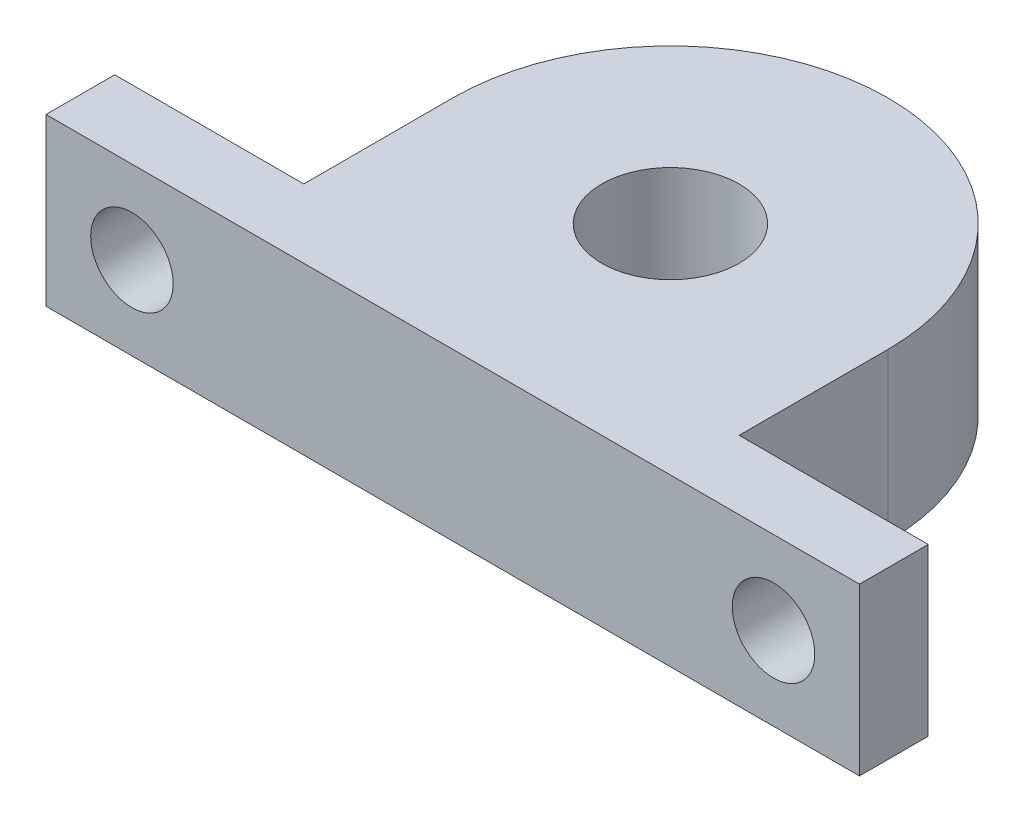
ISO-10303-21;
HEADER;
FILE_DESCRIPTION(('STEP AP214'),'2;1');
FILE_NAME('part.step','',(''),(''),'','','');
FILE_SCHEMA(('AUTOMOTIVE_DESIGN { 1 0 10303 214 1 1 1 1 }'));
ENDSEC;
DATA;
#1=APPLICATION_CONTEXT('core data for automotive mechanical design processes');
#2=APPLICATION_PROTOCOL_DEFINITION('international standard','automotive_design',2000,#1);
#3=PRODUCT_CONTEXT('',#1,'mechanical');
#4=PRODUCT('Part','Part','',(#3));
#5=PRODUCT_RELATED_PRODUCT_CATEGORY('part','',(#4));
#6=PRODUCT_DEFINITION_FORMATION('','',#4);
#7=PRODUCT_DEFINITION_CONTEXT('part definition',#1,'design');
#8=PRODUCT_DEFINITION('design','',#6,#7);
#9=PRODUCT_DEFINITION_SHAPE('','',#8);
#10=(LENGTH_UNIT() NAMED_UNIT(*) SI_UNIT(.MILLI.,.METRE.));
#11=(NAMED_UNIT(*) PLANE_ANGLE_UNIT() SI_UNIT($,.RADIAN.));
#12=(NAMED_UNIT(*) SI_UNIT($,.STERADIAN.) SOLID_ANGLE_UNIT());
#13=UNCERTAINTY_MEASURE_WITH_UNIT(LENGTH_MEASURE(1.E-05),#10,'distance_accuracy_value','');
#14=(GEOMETRIC_REPRESENTATION_CONTEXT(3) GLOBAL_UNCERTAINTY_ASSIGNED_CONTEXT((#13)) GLOBAL_UNIT_ASSIGNED_CONTEXT((#10,
#11,#12)) REPRESENTATION_CONTEXT('',''));
#15=CARTESIAN_POINT('',(0.,0.,0.));
#16=DIRECTION('',(0.,0.,1.));
#17=DIRECTION('',(1.,0.,0.));
#18=AXIS2_PLACEMENT_3D('',#15,#16,#17);
#19=CARTESIAN_POINT('',(0.,14.5,0.));
#20=DIRECTION('',(0.,-1.,0.));
#21=DIRECTION('',(0.,0.,-1.));
#22=AXIS2_PLACEMENT_3D('',#19,#20,#21);
#23=CYLINDRICAL_SURFACE('',#22,19.);
#24=CARTESIAN_POINT('',(0.,0.,0.));
#25=DIRECTION('',(0.,1.,0.));
#26=DIRECTION('',(0.,0.,1.));
#27=AXIS2_PLACEMENT_3D('',#24,#25,#26);
#28=CIRCLE('',#27,19.);
#29=CARTESIAN_POINT('',(19.,0.,0.));
#30=VERTEX_POINT('',#29);
#31=CARTESIAN_POINT('',(-19.,0.,0.));
#32=VERTEX_POINT('',#31);
#33=EDGE_CURVE('E153',#30,#32,#28,.T.);
#34=ORIENTED_EDGE('',*,*,#33,.T.);
#35=DIRECTION('',(0.,-1.,0.));
#36=VECTOR('',#35,1.);
#37=CARTESIAN_POINT('',(-19.,14.5,0.));
#38=LINE('',#37,#36);
#39=CARTESIAN_POINT('',(-19.,14.5,0.));
#40=VERTEX_POINT('',#39);
#41=EDGE_CURVE('E11',#40,#32,#38,.T.);
#42=ORIENTED_EDGE('',*,*,#41,.F.);
#43=CARTESIAN_POINT('',(0.,14.5,0.));
#44=DIRECTION('',(0.,1.,0.));
#45=DIRECTION('',(0.,0.,1.));
#46=AXIS2_PLACEMENT_3D('',#43,#44,#45);
#47=CIRCLE('',#46,19.);
#48=CARTESIAN_POINT('',(19.,14.5,0.));
#49=VERTEX_POINT('',#48);
#50=EDGE_CURVE('E216',#49,#40,#47,.T.);
#51=ORIENTED_EDGE('',*,*,#50,.F.);
#52=DIRECTION('',(0.,-1.,0.));
#53=VECTOR('',#52,1.);
#54=CARTESIAN_POINT('',(19.,14.5,0.));
#55=LINE('',#54,#53);
#56=EDGE_CURVE('E64',#49,#30,#55,.T.);
#57=ORIENTED_EDGE('',*,*,#56,.T.);
#58=EDGE_LOOP('',(#34,#42,#51,#57));
#59=FACE_BOUND('',#58,.T.);
#60=ADVANCED_FACE('F45',(#59),#23,.T.);
#61=CARTESIAN_POINT('',(-19.,14.5,0.));
#62=DIRECTION('',(1.,0.,0.));
#63=DIRECTION('',(0.,0.,-1.));
#64=AXIS2_PLACEMENT_3D('',#61,#62,#63);
#65=PLANE('',#64);
#66=DIRECTION('',(0.,0.,1.));
#67=VECTOR('',#66,1.);
#68=CARTESIAN_POINT('',(-19.,0.,0.));
#69=LINE('',#68,#67);
#70=CARTESIAN_POINT('',(-19.,0.,13.));
#71=VERTEX_POINT('',#70);
#72=EDGE_CURVE('E156',#32,#71,#69,.T.);
#73=ORIENTED_EDGE('',*,*,#72,.T.);
#74=DIRECTION('',(0.,-1.,0.));
#75=VECTOR('',#74,1.);
#76=CARTESIAN_POINT('',(-19.,14.5,13.));
#77=LINE('',#76,#75);
#78=CARTESIAN_POINT('',(-19.,14.5,13.));
#79=VERTEX_POINT('',#78);
#80=EDGE_CURVE('E56',#79,#71,#77,.T.);
#81=ORIENTED_EDGE('',*,*,#80,.F.);
#82=DIRECTION('',(0.,0.,1.));
#83=VECTOR('',#82,1.);
#84=CARTESIAN_POINT('',(-19.,14.5,0.));
#85=LINE('',#84,#83);
#86=EDGE_CURVE('E103',#40,#79,#85,.T.);
#87=ORIENTED_EDGE('',*,*,#86,.F.);
#88=ORIENTED_EDGE('',*,*,#41,.T.);
#89=EDGE_LOOP('',(#73,#81,#87,#88));
#90=FACE_BOUND('',#89,.T.);
#91=ADVANCED_FACE('F201',(#90),#65,.F.);
#92=CARTESIAN_POINT('',(0.,14.5,13.));
#93=DIRECTION('',(0.,0.,-1.));
#94=DIRECTION('',(-1.,0.,0.));
#95=AXIS2_PLACEMENT_3D('',#92,#93,#94);
#96=PLANE('',#95);
#97=CARTESIAN_POINT('',(-28.,7.24999999999998,13.));
#98=DIRECTION('',(0.,0.,-1.));
#99=DIRECTION('',(1.,0.,0.));
#100=AXIS2_PLACEMENT_3D('',#97,#98,#99);
#101=CIRCLE('',#100,3.6);
#102=CARTESIAN_POINT('',(-31.6,7.24999999999998,13.));
#103=VERTEX_POINT('',#102);
#104=EDGE_CURVE('E260',#103,#103,#101,.T.);
#105=ORIENTED_EDGE('',*,*,#104,.F.);
#106=EDGE_LOOP('',(#105));
#107=FACE_BOUND('',#106,.T.);
#108=DIRECTION('',(1.,0.,0.));
#109=VECTOR('',#108,1.);
#110=CARTESIAN_POINT('',(0.,0.,13.));
#111=LINE('',#110,#109);
#112=CARTESIAN_POINT('',(-35.5,0.,13.));
#113=VERTEX_POINT('',#112);
#114=EDGE_CURVE('E160',#113,#71,#111,.T.);
#115=ORIENTED_EDGE('',*,*,#114,.F.);
#116=DIRECTION('',(0.,-1.,0.));
#117=VECTOR('',#116,1.);
#118=CARTESIAN_POINT('',(-35.5,14.5,13.));
#119=LINE('',#118,#117);
#120=CARTESIAN_POINT('',(-35.5,14.5,13.));
#121=VERTEX_POINT('',#120);
#122=EDGE_CURVE('E191',#121,#113,#119,.T.);
#123=ORIENTED_EDGE('',*,*,#122,.F.);
#124=DIRECTION('',(1.,0.,0.));
#125=VECTOR('',#124,1.);
#126=CARTESIAN_POINT('',(0.,14.5,13.));
#127=LINE('',#126,#125);
#128=EDGE_CURVE('E200',#121,#79,#127,.T.);
#129=ORIENTED_EDGE('',*,*,#128,.T.);
#130=ORIENTED_EDGE('',*,*,#80,.T.);
#131=EDGE_LOOP('',(#115,#123,#129,#130));
#132=FACE_BOUND('',#131,.T.);
#133=ADVANCED_FACE('F198',(#107,#132),#96,.T.);
#134=CARTESIAN_POINT('',(-35.5,14.5,0.));
#135=DIRECTION('',(-1.,0.,0.));
#136=DIRECTION('',(0.,0.,1.));
#137=AXIS2_PLACEMENT_3D('',#134,#135,#136);
#138=PLANE('',#137);
#139=DIRECTION('',(0.,0.,-1.));
#140=VECTOR('',#139,1.);
#141=CARTESIAN_POINT('',(-35.5,0.,0.));
#142=LINE('',#141,#140);
#143=CARTESIAN_POINT('',(-35.5,0.,19.));
#144=VERTEX_POINT('',#143);
#145=EDGE_CURVE('E164',#144,#113,#142,.T.);
#146=ORIENTED_EDGE('',*,*,#145,.F.);
#147=DIRECTION('',(0.,-1.,0.));
#148=VECTOR('',#147,1.);
#149=CARTESIAN_POINT('',(-35.5,14.5,19.));
#150=LINE('',#149,#148);
#151=CARTESIAN_POINT('',(-35.5,14.5,19.));
#152=VERTEX_POINT('',#151);
#153=EDGE_CURVE('E188',#152,#144,#150,.T.);
#154=ORIENTED_EDGE('',*,*,#153,.F.);
#155=DIRECTION('',(0.,0.,-1.));
#156=VECTOR('',#155,1.);
#157=CARTESIAN_POINT('',(-35.5,14.5,0.));
#158=LINE('',#157,#156);
#159=EDGE_CURVE('E210',#152,#121,#158,.T.);
#160=ORIENTED_EDGE('',*,*,#159,.T.);
#161=ORIENTED_EDGE('',*,*,#122,.T.);
#162=EDGE_LOOP('',(#146,#154,#160,#161));
#163=FACE_BOUND('',#162,.T.);
#164=ADVANCED_FACE('F208',(#163),#138,.T.);
#165=CARTESIAN_POINT('',(0.,14.5,18.9999999999999));
#166=DIRECTION('',(0.,0.,1.));
#167=DIRECTION('',(1.,0.,0.));
#168=AXIS2_PLACEMENT_3D('',#165,#166,#167);
#169=PLANE('',#168);
#170=CARTESIAN_POINT('',(28.,7.24999999999998,18.9999999999998));
#171=DIRECTION('',(0.,0.,1.));
#172=DIRECTION('',(1.,0.,0.));
#173=AXIS2_PLACEMENT_3D('',#170,#171,#172);
#174=CIRCLE('',#173,3.6);
#175=CARTESIAN_POINT('',(24.4,7.24999999999998,18.9999999999998));
#176=VERTEX_POINT('',#175);
#177=EDGE_CURVE('E259',#176,#176,#174,.T.);
#178=ORIENTED_EDGE('',*,*,#177,.F.);
#179=EDGE_LOOP('',(#178));
#180=FACE_BOUND('',#179,.T.);
#181=CARTESIAN_POINT('',(-28.,7.24999999999998,19.));
#182=DIRECTION('',(0.,0.,1.));
#183=DIRECTION('',(1.,0.,0.));
#184=AXIS2_PLACEMENT_3D('',#181,#182,#183);
#185=CIRCLE('',#184,3.6);
#186=CARTESIAN_POINT('',(-31.6,7.24999999999998,19.));
#187=VERTEX_POINT('',#186);
#188=EDGE_CURVE('E49',#187,#187,#185,.T.);
#189=ORIENTED_EDGE('',*,*,#188,.F.);
#190=EDGE_LOOP('',(#189));
#191=FACE_BOUND('',#190,.T.);
#192=DIRECTION('',(-1.,0.,0.));
#193=VECTOR('',#192,1.);
#194=CARTESIAN_POINT('',(0.,0.,18.9999999999999));
#195=LINE('',#194,#193);
#196=CARTESIAN_POINT('',(35.5000000000001,0.,18.9999999999998));
#197=VERTEX_POINT('',#196);
#198=EDGE_CURVE('E168',#197,#144,#195,.T.);
#199=ORIENTED_EDGE('',*,*,#198,.F.);
#200=DIRECTION('',(0.,-1.,0.));
#201=VECTOR('',#200,1.);
#202=CARTESIAN_POINT('',(35.5000000000001,14.5,18.9999999999998));
#203=LINE('',#202,#201);
#204=CARTESIAN_POINT('',(35.5000000000001,14.5,18.9999999999998));
#205=VERTEX_POINT('',#204);
#206=EDGE_CURVE('E139',#205,#197,#203,.T.);
#207=ORIENTED_EDGE('',*,*,#206,.F.);
#208=DIRECTION('',(-1.,0.,0.));
#209=VECTOR('',#208,1.);
#210=CARTESIAN_POINT('',(0.,14.5,18.9999999999999));
#211=LINE('',#210,#209);
#212=EDGE_CURVE('E127',#205,#152,#211,.T.);
#213=ORIENTED_EDGE('',*,*,#212,.T.);
#214=ORIENTED_EDGE('',*,*,#153,.T.);
#215=EDGE_LOOP('',(#199,#207,#213,#214));
#216=FACE_BOUND('',#215,.T.);
#217=ADVANCED_FACE('F221',(#180,#191,#216),#169,.T.);
#218=CARTESIAN_POINT('',(35.5,14.5,-2.46330733588707E-13));
#219=DIRECTION('',(-1.,0.,0.));
#220=DIRECTION('',(0.,0.,1.));
#221=AXIS2_PLACEMENT_3D('',#218,#219,#220);
#222=PLANE('',#221);
#223=DIRECTION('',(0.,0.,-1.));
#224=VECTOR('',#223,1.);
#225=CARTESIAN_POINT('',(35.5,0.,-2.46330733588707E-13));
#226=LINE('',#225,#224);
#227=CARTESIAN_POINT('',(35.5000000000001,0.,12.9999999999998));
#228=VERTEX_POINT('',#227);
#229=EDGE_CURVE('E135',#197,#228,#226,.T.);
#230=ORIENTED_EDGE('',*,*,#229,.T.);
#231=DIRECTION('',(0.,-1.,0.));
#232=VECTOR('',#231,1.);
#233=CARTESIAN_POINT('',(35.5000000000001,14.5,12.9999999999998));
#234=LINE('',#233,#232);
#235=CARTESIAN_POINT('',(35.5000000000001,14.5,12.9999999999998));
#236=VERTEX_POINT('',#235);
#237=EDGE_CURVE('E132',#236,#228,#234,.T.);
#238=ORIENTED_EDGE('',*,*,#237,.F.);
#239=DIRECTION('',(0.,0.,-1.));
#240=VECTOR('',#239,1.);
#241=CARTESIAN_POINT('',(35.5,14.5,-2.46330733588707E-13));
#242=LINE('',#241,#240);
#243=EDGE_CURVE('E119',#205,#236,#242,.T.);
#244=ORIENTED_EDGE('',*,*,#243,.F.);
#245=ORIENTED_EDGE('',*,*,#206,.T.);
#246=EDGE_LOOP('',(#230,#238,#244,#245));
#247=FACE_BOUND('',#246,.T.);
#248=ADVANCED_FACE('F133',(#247),#222,.F.);
#249=CARTESIAN_POINT('',(1.33368789187626E-13,14.5,13.0000000000001));
#250=DIRECTION('',(0.,0.,1.));
#251=DIRECTION('',(1.,0.,0.));
#252=AXIS2_PLACEMENT_3D('',#249,#250,#251);
#253=PLANE('',#252);
#254=CARTESIAN_POINT('',(28.,7.24999999999998,13.));
#255=DIRECTION('',(0.,0.,-1.));
#256=DIRECTION('',(-1.,0.,0.));
#257=AXIS2_PLACEMENT_3D('',#254,#255,#256);
#258=CIRCLE('',#257,3.6);
#259=CARTESIAN_POINT('',(24.4,7.24999999999998,13.));
#260=VERTEX_POINT('',#259);
#261=EDGE_CURVE('E256',#260,#260,#258,.T.);
#262=ORIENTED_EDGE('',*,*,#261,.F.);
#263=EDGE_LOOP('',(#262));
#264=FACE_BOUND('',#263,.T.);
#265=DIRECTION('',(-1.,0.,0.));
#266=VECTOR('',#265,1.);
#267=CARTESIAN_POINT('',(1.33368789187626E-13,0.,13.0000000000001));
#268=LINE('',#267,#266);
#269=CARTESIAN_POINT('',(19.0000000000001,0.,12.9999999999999));
#270=VERTEX_POINT('',#269);
#271=EDGE_CURVE('E174',#228,#270,#268,.T.);
#272=ORIENTED_EDGE('',*,*,#271,.T.);
#273=DIRECTION('',(0.,-1.,0.));
#274=VECTOR('',#273,1.);
#275=CARTESIAN_POINT('',(19.0000000000001,14.5,12.9999999999999));
#276=LINE('',#275,#274);
#277=CARTESIAN_POINT('',(19.0000000000001,14.5,12.9999999999999));
#278=VERTEX_POINT('',#277);
#279=EDGE_CURVE('E91',#278,#270,#276,.T.);
#280=ORIENTED_EDGE('',*,*,#279,.F.);
#281=DIRECTION('',(-1.,0.,0.));
#282=VECTOR('',#281,1.);
#283=CARTESIAN_POINT('',(1.33368789187626E-13,14.5,13.0000000000001));
#284=LINE('',#283,#282);
#285=EDGE_CURVE('E124',#236,#278,#284,.T.);
#286=ORIENTED_EDGE('',*,*,#285,.F.);
#287=ORIENTED_EDGE('',*,*,#237,.T.);
#288=EDGE_LOOP('',(#272,#280,#286,#287));
#289=FACE_BOUND('',#288,.T.);
#290=ADVANCED_FACE('F141',(#264,#289),#253,.F.);
#291=CARTESIAN_POINT('',(0.,14.5,0.));
#292=DIRECTION('',(0.,-1.,0.));
#293=DIRECTION('',(0.,0.,-1.));
#294=AXIS2_PLACEMENT_3D('',#291,#292,#293);
#295=CYLINDRICAL_SURFACE('',#294,6.);
#296=CARTESIAN_POINT('',(0.,14.5,0.));
#297=DIRECTION('',(0.,1.,0.));
#298=DIRECTION('',(0.,0.,1.));
#299=AXIS2_PLACEMENT_3D('',#296,#297,#298);
#300=CIRCLE('',#299,6.);
#301=CARTESIAN_POINT('',(0.,14.5,-6.));
#302=VERTEX_POINT('',#301);
#303=EDGE_CURVE('E181',#302,#302,#300,.T.);
#304=CARTESIAN_POINT('',(0.,0.,0.));
#305=DIRECTION('',(0.,1.,0.));
#306=DIRECTION('',(0.,0.,1.));
#307=AXIS2_PLACEMENT_3D('',#304,#305,#306);
#308=CIRCLE('',#307,6.);
#309=CARTESIAN_POINT('',(0.,0.,-6.));
#310=VERTEX_POINT('',#309);
#311=EDGE_CURVE('E149',#310,#310,#308,.T.);
#312=CARTESIAN_POINT('',(0.,14.5,-6.));
#313=CARTESIAN_POINT('',(0.,14.3489583333333,-6.));
#314=CARTESIAN_POINT('',(0.,14.1979166666667,-6.));
#315=CARTESIAN_POINT('',(0.,13.8958333333333,-6.));
#316=CARTESIAN_POINT('',(0.,13.7447916666667,-6.));
#317=CARTESIAN_POINT('',(0.,13.4427083333333,-6.));
#318=CARTESIAN_POINT('',(0.,13.2916666666667,-6.));
#319=CARTESIAN_POINT('',(0.,12.9895833333333,-6.));
#320=CARTESIAN_POINT('',(0.,12.8385416666667,-6.));
#321=CARTESIAN_POINT('',(0.,12.5364583333333,-6.));
#322=CARTESIAN_POINT('',(0.,12.3854166666667,-6.));
#323=CARTESIAN_POINT('',(0.,12.0833333333333,-6.));
#324=CARTESIAN_POINT('',(0.,11.9322916666667,-6.));
#325=CARTESIAN_POINT('',(0.,11.6302083333333,-6.));
#326=CARTESIAN_POINT('',(0.,11.4791666666667,-6.));
#327=CARTESIAN_POINT('',(0.,11.1770833333333,-6.));
#328=CARTESIAN_POINT('',(0.,11.0260416666667,-6.));
#329=CARTESIAN_POINT('',(0.,10.7239583333333,-6.));
#330=CARTESIAN_POINT('',(0.,10.5729166666667,-6.));
#331=CARTESIAN_POINT('',(0.,10.2708333333333,-6.));
#332=CARTESIAN_POINT('',(0.,10.1197916666667,-6.));
#333=CARTESIAN_POINT('',(0.,9.81770833333333,-6.));
#334=CARTESIAN_POINT('',(0.,9.66666666666667,-6.));
#335=CARTESIAN_POINT('',(0.,9.36458333333333,-6.));
#336=CARTESIAN_POINT('',(0.,9.21354166666667,-6.));
#337=CARTESIAN_POINT('',(0.,8.91145833333333,-6.));
#338=CARTESIAN_POINT('',(0.,8.76041666666667,-6.));
#339=CARTESIAN_POINT('',(0.,8.45833333333333,-6.));
#340=CARTESIAN_POINT('',(0.,8.30729166666667,-6.));
#341=CARTESIAN_POINT('',(0.,8.00520833333333,-6.));
#342=CARTESIAN_POINT('',(0.,7.85416666666667,-6.));
#343=CARTESIAN_POINT('',(0.,7.55208333333333,-6.));
#344=CARTESIAN_POINT('',(0.,7.40104166666667,-6.));
#345=CARTESIAN_POINT('',(0.,7.09895833333333,-6.));
#346=CARTESIAN_POINT('',(0.,6.94791666666667,-6.));
#347=CARTESIAN_POINT('',(0.,6.64583333333333,-6.));
#348=CARTESIAN_POINT('',(0.,6.49479166666667,-6.));
#349=CARTESIAN_POINT('',(0.,6.19270833333333,-6.));
#350=CARTESIAN_POINT('',(0.,6.04166666666667,-6.));
#351=CARTESIAN_POINT('',(0.,5.73958333333333,-6.));
#352=CARTESIAN_POINT('',(0.,5.58854166666667,-6.));
#353=CARTESIAN_POINT('',(0.,5.28645833333333,-6.));
#354=CARTESIAN_POINT('',(0.,5.13541666666667,-6.));
#355=CARTESIAN_POINT('',(0.,4.83333333333333,-6.));
#356=CARTESIAN_POINT('',(0.,4.68229166666667,-6.));
#357=CARTESIAN_POINT('',(0.,4.38020833333333,-6.));
#358=CARTESIAN_POINT('',(0.,4.22916666666667,-6.));
#359=CARTESIAN_POINT('',(0.,3.92708333333333,-6.));
#360=CARTESIAN_POINT('',(0.,3.77604166666667,-6.));
#361=CARTESIAN_POINT('',(0.,3.47395833333333,-6.));
#362=CARTESIAN_POINT('',(0.,3.32291666666667,-6.));
#363=CARTESIAN_POINT('',(0.,3.02083333333333,-6.));
#364=CARTESIAN_POINT('',(0.,2.86979166666667,-6.));
#365=CARTESIAN_POINT('',(0.,2.56770833333333,-6.));
#366=CARTESIAN_POINT('',(0.,2.41666666666667,-6.));
#367=CARTESIAN_POINT('',(0.,2.11458333333333,-6.));
#368=CARTESIAN_POINT('',(0.,1.96354166666667,-6.));
#369=CARTESIAN_POINT('',(0.,1.66145833333333,-6.));
#370=CARTESIAN_POINT('',(0.,1.51041666666667,-6.));
#371=CARTESIAN_POINT('',(0.,1.20833333333333,-6.));
#372=CARTESIAN_POINT('',(0.,1.05729166666667,-6.));
#373=CARTESIAN_POINT('',(0.,0.755208333333334,-6.));
#374=CARTESIAN_POINT('',(0.,0.604166666666667,-6.));
#375=CARTESIAN_POINT('',(0.,0.302083333333333,-6.));
#376=CARTESIAN_POINT('',(0.,0.151041666666667,-6.));
#377=CARTESIAN_POINT('',(0.,0.,-6.));
#378=B_SPLINE_CURVE_WITH_KNOTS('',3,(#312,#313,#314,#315,#316,#317,#318,#319,#320,#321,#322,
#323,#324,#325,#326,#327,#328,#329,#330,#331,#332,#333,#334,#335,#336,#337,#338,#339,#340,#341,
#342,#343,#344,#345,#346,#347,#348,#349,#350,#351,#352,#353,#354,#355,#356,#357,#358,#359,#360,
#361,#362,#363,#364,#365,#366,#367,#368,#369,#370,#371,#372,#373,#374,#375,#376,#377),
.UNSPECIFIED.,.F.,.F.,(4,2,2,2,2,2,2,2,2,2,2,2,2,2,2,2,2,2,2,2,2,2,2,2,2,2,2,2,2,2,2,2,4),(0.,
0.453124999999999,0.906249999999999,1.359375,1.8125,2.265625,2.71875,3.171875,3.625,4.078125,
4.53125,4.984375,5.4375,5.890625,6.34375,6.796875,7.25,7.703125,8.15625,8.609375,9.0625,
9.515625,9.96875,10.421875,10.875,11.328125,11.78125,12.234375,12.6875,13.140625,13.59375,
14.046875,14.5),.UNSPECIFIED.);
#379=EDGE_CURVE('BSEAM47',#302,#310,#378,.T.);
#380=ORIENTED_EDGE('',*,*,#303,.T.);
#381=ORIENTED_EDGE('',*,*,#311,.F.);
#382=ORIENTED_EDGE('',*,*,#379,.T.);
#383=ORIENTED_EDGE('',*,*,#379,.F.);
#384=EDGE_LOOP('',(#380,#382,#381,#383));
#385=FACE_BOUND('',#384,.T.);
#386=ADVANCED_FACE('F47',(#385),#295,.F.);
#387=CARTESIAN_POINT('',(19.,14.5,-1.3183898417424E-13));
#388=DIRECTION('',(1.,0.,0.));
#389=DIRECTION('',(0.,0.,-1.));
#390=AXIS2_PLACEMENT_3D('',#387,#388,#389);
#391=PLANE('',#390);
#392=DIRECTION('',(0.,0.,1.));
#393=VECTOR('',#392,1.);
#394=CARTESIAN_POINT('',(19.,0.,-1.3183898417424E-13));
#395=LINE('',#394,#393);
#396=EDGE_CURVE('E177',#30,#270,#395,.T.);
#397=ORIENTED_EDGE('',*,*,#396,.F.);
#398=ORIENTED_EDGE('',*,*,#56,.F.);
#399=DIRECTION('',(0.,0.,1.));
#400=VECTOR('',#399,1.);
#401=CARTESIAN_POINT('',(19.,14.5,-1.3183898417424E-13));
#402=LINE('',#401,#400);
#403=EDGE_CURVE('E143',#49,#278,#402,.T.);
#404=ORIENTED_EDGE('',*,*,#403,.T.);
#405=ORIENTED_EDGE('',*,*,#279,.T.);
#406=EDGE_LOOP('',(#397,#398,#404,#405));
#407=FACE_BOUND('',#406,.T.);
#408=ADVANCED_FACE('F222',(#407),#391,.T.);
#409=CARTESIAN_POINT('',(0.,14.5,0.));
#410=DIRECTION('',(0.,1.,0.));
#411=DIRECTION('',(0.,0.,1.));
#412=AXIS2_PLACEMENT_3D('',#409,#410,#411);
#413=PLANE('',#412);
#414=ORIENTED_EDGE('',*,*,#303,.F.);
#415=EDGE_LOOP('',(#414));
#416=FACE_BOUND('',#415,.T.);
#417=ORIENTED_EDGE('',*,*,#50,.T.);
#418=ORIENTED_EDGE('',*,*,#86,.T.);
#419=ORIENTED_EDGE('',*,*,#128,.F.);
#420=ORIENTED_EDGE('',*,*,#159,.F.);
#421=ORIENTED_EDGE('',*,*,#212,.F.);
#422=ORIENTED_EDGE('',*,*,#243,.T.);
#423=ORIENTED_EDGE('',*,*,#285,.T.);
#424=ORIENTED_EDGE('',*,*,#403,.F.);
#425=EDGE_LOOP('',(#417,#418,#419,#420,#421,#422,#423,#424));
#426=FACE_BOUND('',#425,.T.);
#427=ADVANCED_FACE('F121',(#416,#426),#413,.T.);
#428=CARTESIAN_POINT('',(0.,0.,0.));
#429=DIRECTION('',(0.,1.,0.));
#430=DIRECTION('',(0.,0.,1.));
#431=AXIS2_PLACEMENT_3D('',#428,#429,#430);
#432=PLANE('',#431);
#433=ORIENTED_EDGE('',*,*,#311,.T.);
#434=EDGE_LOOP('',(#433));
#435=FACE_BOUND('',#434,.T.);
#436=ORIENTED_EDGE('',*,*,#33,.F.);
#437=ORIENTED_EDGE('',*,*,#396,.T.);
#438=ORIENTED_EDGE('',*,*,#271,.F.);
#439=ORIENTED_EDGE('',*,*,#229,.F.);
#440=ORIENTED_EDGE('',*,*,#198,.T.);
#441=ORIENTED_EDGE('',*,*,#145,.T.);
#442=ORIENTED_EDGE('',*,*,#114,.T.);
#443=ORIENTED_EDGE('',*,*,#72,.F.);
#444=EDGE_LOOP('',(#436,#437,#438,#439,#440,#441,#442,#443));
#445=FACE_BOUND('',#444,.T.);
#446=ADVANCED_FACE('F204',(#435,#445),#432,.F.);
#447=CARTESIAN_POINT('',(28.,7.24999999999998,27.5));
#448=DIRECTION('',(0.,0.,-1.));
#449=DIRECTION('',(-1.,0.,0.));
#450=AXIS2_PLACEMENT_3D('',#447,#448,#449);
#451=CYLINDRICAL_SURFACE('',#450,3.6);
#452=CARTESIAN_POINT('',(24.4,7.24999999999998,18.9999999999998));
#453=CARTESIAN_POINT('',(24.4,7.24999999999998,18.9374999999998));
#454=CARTESIAN_POINT('',(24.4,7.24999999999998,18.8749999999998));
#455=CARTESIAN_POINT('',(24.4,7.24999999999998,18.7499999999998));
#456=CARTESIAN_POINT('',(24.4,7.24999999999998,18.6874999999998));
#457=CARTESIAN_POINT('',(24.4,7.24999999999998,18.5624999999998));
#458=CARTESIAN_POINT('',(24.4,7.24999999999998,18.4999999999998));
#459=CARTESIAN_POINT('',(24.4,7.24999999999998,18.3749999999998));
#460=CARTESIAN_POINT('',(24.4,7.24999999999998,18.3124999999998));
#461=CARTESIAN_POINT('',(24.4,7.24999999999998,18.1874999999998));
#462=CARTESIAN_POINT('',(24.4,7.24999999999998,18.1249999999998));
#463=CARTESIAN_POINT('',(24.4,7.24999999999998,17.9999999999998));
#464=CARTESIAN_POINT('',(24.4,7.24999999999998,17.9374999999998));
#465=CARTESIAN_POINT('',(24.4,7.24999999999998,17.8124999999999));
#466=CARTESIAN_POINT('',(24.4,7.24999999999998,17.7499999999999));
#467=CARTESIAN_POINT('',(24.4,7.24999999999998,17.6249999999999));
#468=CARTESIAN_POINT('',(24.4,7.24999999999998,17.5624999999999));
#469=CARTESIAN_POINT('',(24.4,7.24999999999998,17.4374999999999));
#470=CARTESIAN_POINT('',(24.4,7.24999999999998,17.3749999999999));
#471=CARTESIAN_POINT('',(24.4,7.24999999999998,17.2499999999999));
#472=CARTESIAN_POINT('',(24.4,7.24999999999998,17.1874999999999));
#473=CARTESIAN_POINT('',(24.4,7.24999999999998,17.0624999999999));
#474=CARTESIAN_POINT('',(24.4,7.24999999999998,16.9999999999999));
#475=CARTESIAN_POINT('',(24.4,7.24999999999998,16.8749999999999));
#476=CARTESIAN_POINT('',(24.4,7.24999999999998,16.8124999999999));
#477=CARTESIAN_POINT('',(24.4,7.24999999999998,16.6874999999999));
#478=CARTESIAN_POINT('',(24.4,7.24999999999998,16.6249999999999));
#479=CARTESIAN_POINT('',(24.4,7.24999999999998,16.4999999999999));
#480=CARTESIAN_POINT('',(24.4,7.24999999999998,16.4374999999999));
#481=CARTESIAN_POINT('',(24.4,7.24999999999998,16.3124999999999));
#482=CARTESIAN_POINT('',(24.4,7.24999999999998,16.2499999999999));
#483=CARTESIAN_POINT('',(24.4,7.24999999999998,16.1249999999999));
#484=CARTESIAN_POINT('',(24.4,7.24999999999998,16.0624999999999));
#485=CARTESIAN_POINT('',(24.4,7.24999999999998,15.9374999999999));
#486=CARTESIAN_POINT('',(24.4,7.24999999999998,15.8749999999999));
#487=CARTESIAN_POINT('',(24.4,7.24999999999998,15.7499999999999));
#488=CARTESIAN_POINT('',(24.4,7.24999999999998,15.6874999999999));
#489=CARTESIAN_POINT('',(24.4,7.24999999999998,15.5624999999999));
#490=CARTESIAN_POINT('',(24.4,7.24999999999998,15.4999999999999));
#491=CARTESIAN_POINT('',(24.4,7.24999999999998,15.3749999999999));
#492=CARTESIAN_POINT('',(24.4,7.24999999999998,15.3124999999999));
#493=CARTESIAN_POINT('',(24.4,7.24999999999998,15.1874999999999));
#494=CARTESIAN_POINT('',(24.4,7.24999999999998,15.1249999999999));
#495=CARTESIAN_POINT('',(24.4,7.24999999999998,14.9999999999999));
#496=CARTESIAN_POINT('',(24.4,7.24999999999998,14.9374999999999));
#497=CARTESIAN_POINT('',(24.4,7.24999999999998,14.8124999999999));
#498=CARTESIAN_POINT('',(24.4,7.24999999999998,14.7499999999999));
#499=CARTESIAN_POINT('',(24.4,7.24999999999998,14.6249999999999));
#500=CARTESIAN_POINT('',(24.4,7.24999999999998,14.5625));
#501=CARTESIAN_POINT('',(24.4,7.24999999999998,14.4375));
#502=CARTESIAN_POINT('',(24.4,7.24999999999998,14.375));
#503=CARTESIAN_POINT('',(24.4,7.24999999999998,14.25));
#504=CARTESIAN_POINT('',(24.4,7.24999999999998,14.1875));
#505=CARTESIAN_POINT('',(24.4,7.24999999999998,14.0625));
#506=CARTESIAN_POINT('',(24.4,7.24999999999998,14.));
#507=CARTESIAN_POINT('',(24.4,7.24999999999998,13.875));
#508=CARTESIAN_POINT('',(24.4,7.24999999999998,13.8125));
#509=CARTESIAN_POINT('',(24.4,7.24999999999998,13.6875));
#510=CARTESIAN_POINT('',(24.4,7.24999999999998,13.625));
#511=CARTESIAN_POINT('',(24.4,7.24999999999998,13.5));
#512=CARTESIAN_POINT('',(24.4,7.24999999999998,13.4375));
#513=CARTESIAN_POINT('',(24.4,7.24999999999998,13.3125));
#514=CARTESIAN_POINT('',(24.4,7.24999999999998,13.25));
#515=CARTESIAN_POINT('',(24.4,7.24999999999998,13.125));
#516=CARTESIAN_POINT('',(24.4,7.24999999999998,13.0625));
#517=CARTESIAN_POINT('',(24.4,7.24999999999998,13.));
#518=B_SPLINE_CURVE_WITH_KNOTS('',3,(#452,#453,#454,#455,#456,#457,#458,#459,#460,#461,#462,
#463,#464,#465,#466,#467,#468,#469,#470,#471,#472,#473,#474,#475,#476,#477,#478,#479,#480,#481,
#482,#483,#484,#485,#486,#487,#488,#489,#490,#491,#492,#493,#494,#495,#496,#497,#498,#499,#500,
#501,#502,#503,#504,#505,#506,#507,#508,#509,#510,#511,#512,#513,#514,#515,#516,#517),
.UNSPECIFIED.,.F.,.F.,(4,2,2,2,2,2,2,2,2,2,2,2,2,2,2,2,2,2,2,2,2,2,2,2,2,2,2,2,2,2,2,2,4),(0.,
0.187499999999997,0.37499999999999,0.562499999999987,0.74999999999998,0.937499999999973,
1.12499999999997,1.31249999999996,1.49999999999995,1.68749999999995,1.87499999999995,
2.06249999999994,2.24999999999993,2.43749999999993,2.62499999999992,2.81249999999991,
2.99999999999991,3.18749999999991,3.3749999999999,3.56249999999989,3.74999999999989,
3.93749999999988,4.12499999999987,4.31249999999987,4.49999999999986,4.68749999999986,
4.87499999999985,5.06249999999984,5.24999999999984,5.43749999999983,5.62499999999983,
5.81249999999982,5.99999999999982),.UNSPECIFIED.);
#519=EDGE_CURVE('BSEAM280',#176,#260,#518,.T.);
#520=ORIENTED_EDGE('',*,*,#177,.T.);
#521=ORIENTED_EDGE('',*,*,#261,.T.);
#522=ORIENTED_EDGE('',*,*,#519,.T.);
#523=ORIENTED_EDGE('',*,*,#519,.F.);
#524=EDGE_LOOP('',(#520,#522,#521,#523));
#525=FACE_BOUND('',#524,.T.);
#526=ADVANCED_FACE('F280',(#525),#451,.F.);
#527=CARTESIAN_POINT('',(-28.,7.24999999999998,27.5));
#528=DIRECTION('',(0.,0.,-1.));
#529=DIRECTION('',(-1.,0.,0.));
#530=AXIS2_PLACEMENT_3D('',#527,#528,#529);
#531=CYLINDRICAL_SURFACE('',#530,3.6);
#532=CARTESIAN_POINT('',(-31.6,7.24999999999998,19.));
#533=CARTESIAN_POINT('',(-31.6,7.24999999999998,18.9375));
#534=CARTESIAN_POINT('',(-31.6,7.24999999999998,18.875));
#535=CARTESIAN_POINT('',(-31.6,7.24999999999998,18.75));
#536=CARTESIAN_POINT('',(-31.6,7.24999999999998,18.6875));
#537=CARTESIAN_POINT('',(-31.6,7.24999999999998,18.5625));
#538=CARTESIAN_POINT('',(-31.6,7.24999999999998,18.5));
#539=CARTESIAN_POINT('',(-31.6,7.24999999999998,18.375));
#540=CARTESIAN_POINT('',(-31.6,7.24999999999998,18.3125));
#541=CARTESIAN_POINT('',(-31.6,7.24999999999998,18.1875));
#542=CARTESIAN_POINT('',(-31.6,7.24999999999998,18.125));
#543=CARTESIAN_POINT('',(-31.6,7.24999999999998,18.));
#544=CARTESIAN_POINT('',(-31.6,7.24999999999998,17.9375));
#545=CARTESIAN_POINT('',(-31.6,7.24999999999998,17.8125));
#546=CARTESIAN_POINT('',(-31.6,7.24999999999998,17.75));
#547=CARTESIAN_POINT('',(-31.6,7.24999999999998,17.625));
#548=CARTESIAN_POINT('',(-31.6,7.24999999999998,17.5625));
#549=CARTESIAN_POINT('',(-31.6,7.24999999999998,17.4375));
#550=CARTESIAN_POINT('',(-31.6,7.24999999999998,17.375));
#551=CARTESIAN_POINT('',(-31.6,7.24999999999998,17.25));
#552=CARTESIAN_POINT('',(-31.6,7.24999999999998,17.1875));
#553=CARTESIAN_POINT('',(-31.6,7.24999999999998,17.0625));
#554=CARTESIAN_POINT('',(-31.6,7.24999999999998,17.));
#555=CARTESIAN_POINT('',(-31.6,7.24999999999998,16.875));
#556=CARTESIAN_POINT('',(-31.6,7.24999999999998,16.8125));
#557=CARTESIAN_POINT('',(-31.6,7.24999999999998,16.6875));
#558=CARTESIAN_POINT('',(-31.6,7.24999999999998,16.625));
#559=CARTESIAN_POINT('',(-31.6,7.24999999999998,16.5));
#560=CARTESIAN_POINT('',(-31.6,7.24999999999998,16.4375));
#561=CARTESIAN_POINT('',(-31.6,7.24999999999998,16.3125));
#562=CARTESIAN_POINT('',(-31.6,7.24999999999998,16.25));
#563=CARTESIAN_POINT('',(-31.6,7.24999999999998,16.125));
#564=CARTESIAN_POINT('',(-31.6,7.24999999999998,16.0625));
#565=CARTESIAN_POINT('',(-31.6,7.24999999999998,15.9375));
#566=CARTESIAN_POINT('',(-31.6,7.24999999999998,15.875));
#567=CARTESIAN_POINT('',(-31.6,7.24999999999998,15.75));
#568=CARTESIAN_POINT('',(-31.6,7.24999999999998,15.6875));
#569=CARTESIAN_POINT('',(-31.6,7.24999999999998,15.5625));
#570=CARTESIAN_POINT('',(-31.6,7.24999999999998,15.5));
#571=CARTESIAN_POINT('',(-31.6,7.24999999999998,15.375));
#572=CARTESIAN_POINT('',(-31.6,7.24999999999998,15.3125));
#573=CARTESIAN_POINT('',(-31.6,7.24999999999998,15.1875));
#574=CARTESIAN_POINT('',(-31.6,7.24999999999998,15.125));
#575=CARTESIAN_POINT('',(-31.6,7.24999999999998,15.));
#576=CARTESIAN_POINT('',(-31.6,7.24999999999998,14.9375));
#577=CARTESIAN_POINT('',(-31.6,7.24999999999998,14.8125));
#578=CARTESIAN_POINT('',(-31.6,7.24999999999998,14.75));
#579=CARTESIAN_POINT('',(-31.6,7.24999999999998,14.625));
#580=CARTESIAN_POINT('',(-31.6,7.24999999999998,14.5625));
#581=CARTESIAN_POINT('',(-31.6,7.24999999999998,14.4375));
#582=CARTESIAN_POINT('',(-31.6,7.24999999999998,14.375));
#583=CARTESIAN_POINT('',(-31.6,7.24999999999998,14.25));
#584=CARTESIAN_POINT('',(-31.6,7.24999999999998,14.1875));
#585=CARTESIAN_POINT('',(-31.6,7.24999999999998,14.0625));
#586=CARTESIAN_POINT('',(-31.6,7.24999999999998,14.));
#587=CARTESIAN_POINT('',(-31.6,7.24999999999998,13.875));
#588=CARTESIAN_POINT('',(-31.6,7.24999999999998,13.8125));
#589=CARTESIAN_POINT('',(-31.6,7.24999999999998,13.6875));
#590=CARTESIAN_POINT('',(-31.6,7.24999999999998,13.625));
#591=CARTESIAN_POINT('',(-31.6,7.24999999999998,13.5));
#592=CARTESIAN_POINT('',(-31.6,7.24999999999998,13.4375));
#593=CARTESIAN_POINT('',(-31.6,7.24999999999998,13.3125));
#594=CARTESIAN_POINT('',(-31.6,7.24999999999998,13.25));
#595=CARTESIAN_POINT('',(-31.6,7.24999999999998,13.125));
#596=CARTESIAN_POINT('',(-31.6,7.24999999999998,13.0625));
#597=CARTESIAN_POINT('',(-31.6,7.24999999999998,13.));
#598=B_SPLINE_CURVE_WITH_KNOTS('',3,(#532,#533,#534,#535,#536,#537,#538,#539,#540,#541,#542,
#543,#544,#545,#546,#547,#548,#549,#550,#551,#552,#553,#554,#555,#556,#557,#558,#559,#560,#561,
#562,#563,#564,#565,#566,#567,#568,#569,#570,#571,#572,#573,#574,#575,#576,#577,#578,#579,#580,
#581,#582,#583,#584,#585,#586,#587,#588,#589,#590,#591,#592,#593,#594,#595,#596,#597),
.UNSPECIFIED.,.F.,.F.,(4,2,2,2,2,2,2,2,2,2,2,2,2,2,2,2,2,2,2,2,2,2,2,2,2,2,2,2,2,2,2,2,4),(0.,
0.1875,0.375,0.5625,0.750000000000001,0.937500000000001,1.125,1.3125,1.5,1.6875,1.875,
2.06249999999999,2.25,2.4375,2.625,2.8125,3.,3.1875,3.37499999999999,3.56249999999999,
3.74999999999999,3.93749999999999,4.12499999999999,4.31249999999999,4.49999999999999,
4.68749999999999,4.87499999999999,5.06249999999999,5.24999999999999,5.43749999999999,
5.62499999999999,5.81249999999999,5.99999999999999),.UNSPECIFIED.);
#599=EDGE_CURVE('BSEAM276',#187,#103,#598,.T.);
#600=ORIENTED_EDGE('',*,*,#188,.T.);
#601=ORIENTED_EDGE('',*,*,#104,.T.);
#602=ORIENTED_EDGE('',*,*,#599,.T.);
#603=ORIENTED_EDGE('',*,*,#599,.F.);
#604=EDGE_LOOP('',(#600,#602,#601,#603));
#605=FACE_BOUND('',#604,.T.);
#606=ADVANCED_FACE('F276',(#605),#531,.F.);
#607=CLOSED_SHELL('',(#60,#91,#133,#164,#217,#248,#290,#386,#408,#427,#446,#526,#606));
#608=MANIFOLD_SOLID_BREP('B2',#607);
#609=ADVANCED_BREP_SHAPE_REPRESENTATION('',(#18,#608),#14);
#610=SHAPE_DEFINITION_REPRESENTATION(#9,#609);
ENDSEC;
END-ISO-10303-21;
